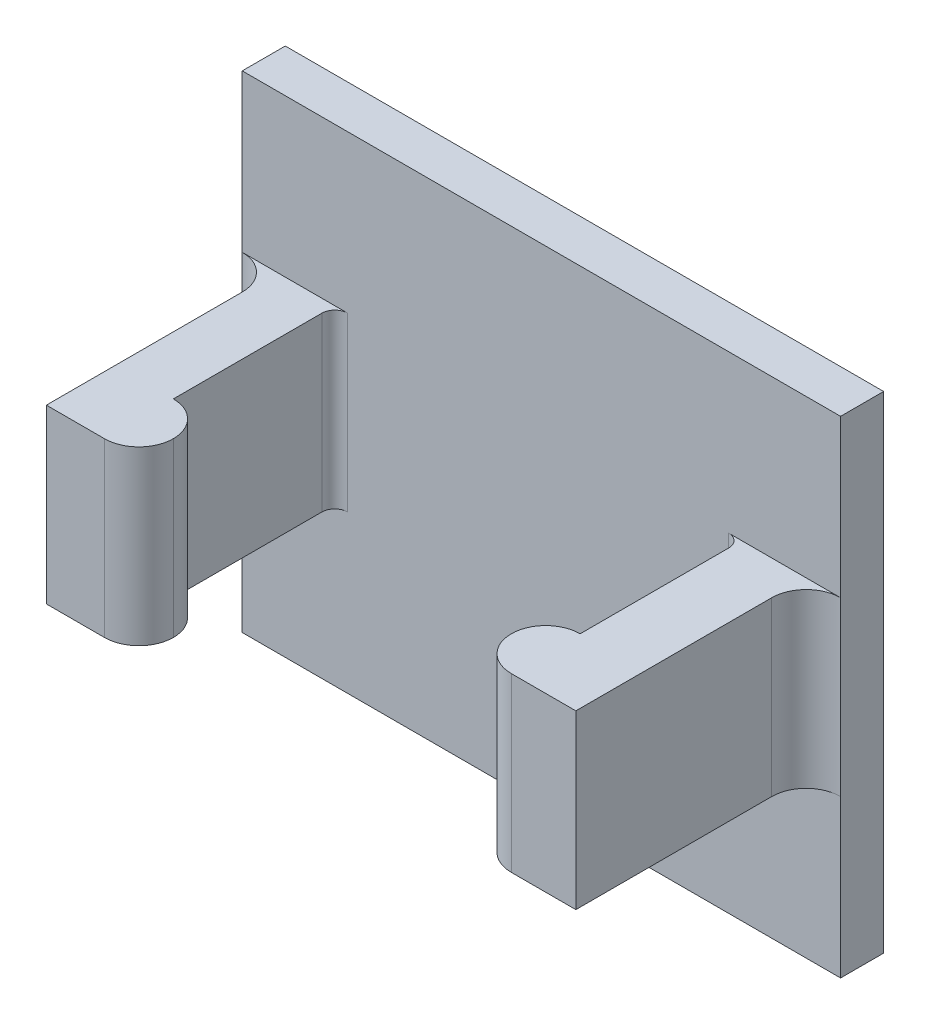
ISO-10303-21;
HEADER;
FILE_DESCRIPTION(('STEP AP214'),'2;1');
FILE_NAME('part.step','',(''),(''),'','','');
FILE_SCHEMA(('AUTOMOTIVE_DESIGN { 1 0 10303 214 1 1 1 1 }'));
ENDSEC;
DATA;
#1=APPLICATION_CONTEXT('core data for automotive mechanical design processes');
#2=APPLICATION_PROTOCOL_DEFINITION('international standard','automotive_design',2000,#1);
#3=PRODUCT_CONTEXT('',#1,'mechanical');
#4=PRODUCT('Part','Part','',(#3));
#5=PRODUCT_RELATED_PRODUCT_CATEGORY('part','',(#4));
#6=PRODUCT_DEFINITION_FORMATION('','',#4);
#7=PRODUCT_DEFINITION_CONTEXT('part definition',#1,'design');
#8=PRODUCT_DEFINITION('design','',#6,#7);
#9=PRODUCT_DEFINITION_SHAPE('','',#8);
#10=(LENGTH_UNIT() NAMED_UNIT(*) SI_UNIT(.MILLI.,.METRE.));
#11=(NAMED_UNIT(*) PLANE_ANGLE_UNIT() SI_UNIT($,.RADIAN.));
#12=(NAMED_UNIT(*) SI_UNIT($,.STERADIAN.) SOLID_ANGLE_UNIT());
#13=UNCERTAINTY_MEASURE_WITH_UNIT(LENGTH_MEASURE(1.E-05),#10,'distance_accuracy_value','');
#14=(GEOMETRIC_REPRESENTATION_CONTEXT(3) GLOBAL_UNCERTAINTY_ASSIGNED_CONTEXT((#13)) GLOBAL_UNIT_ASSIGNED_CONTEXT((#10,
#11,#12)) REPRESENTATION_CONTEXT('',''));
#15=CARTESIAN_POINT('',(0.,0.,0.));
#16=DIRECTION('',(0.,0.,1.));
#17=DIRECTION('',(1.,0.,0.));
#18=AXIS2_PLACEMENT_3D('',#15,#16,#17);
#19=CARTESIAN_POINT('',(6.15,-5.65,1.));
#20=DIRECTION('',(-1.,0.,0.));
#21=DIRECTION('',(0.,0.,1.));
#22=AXIS2_PLACEMENT_3D('',#19,#20,#21);
#23=PLANE('',#22);
#24=DIRECTION('',(0.,0.,-1.));
#25=VECTOR('',#24,1.);
#26=CARTESIAN_POINT('',(6.15,-2.,6.35));
#27=LINE('',#26,#25);
#28=CARTESIAN_POINT('',(6.15,-2.,6.35));
#29=VERTEX_POINT('',#28);
#30=CARTESIAN_POINT('',(6.15,-2.,1.8));
#31=VERTEX_POINT('',#30);
#32=EDGE_CURVE('E259',#29,#31,#27,.T.);
#33=ORIENTED_EDGE('',*,*,#32,.T.);
#34=DIRECTION('',(0.,-1.,0.));
#35=VECTOR('',#34,1.);
#36=CARTESIAN_POINT('',(6.15,2.,1.8));
#37=LINE('',#36,#35);
#38=CARTESIAN_POINT('',(6.15,2.,1.8));
#39=VERTEX_POINT('',#38);
#40=EDGE_CURVE('E63',#31,#39,#37,.F.);
#41=ORIENTED_EDGE('',*,*,#40,.T.);
#42=DIRECTION('',(0.,0.,-1.));
#43=VECTOR('',#42,1.);
#44=CARTESIAN_POINT('',(6.15,2.,6.35));
#45=LINE('',#44,#43);
#46=CARTESIAN_POINT('',(6.15,2.,6.35));
#47=VERTEX_POINT('',#46);
#48=EDGE_CURVE('E274',#47,#39,#45,.T.);
#49=ORIENTED_EDGE('',*,*,#48,.F.);
#50=DIRECTION('',(0.,1.,0.));
#51=VECTOR('',#50,1.);
#52=CARTESIAN_POINT('',(6.15,2.,6.35));
#53=LINE('',#52,#51);
#54=EDGE_CURVE('E247',#29,#47,#53,.T.);
#55=ORIENTED_EDGE('',*,*,#54,.F.);
#56=EDGE_LOOP('',(#33,#41,#49,#55));
#57=FACE_BOUND('',#56,.T.);
#58=ADVANCED_FACE('F41',(#57),#23,.F.);
#59=CARTESIAN_POINT('',(-6.15,-5.65,1.));
#60=DIRECTION('',(1.,0.,0.));
#61=DIRECTION('',(0.,0.,-1.));
#62=AXIS2_PLACEMENT_3D('',#59,#60,#61);
#63=PLANE('',#62);
#64=DIRECTION('',(0.,0.,-1.));
#65=VECTOR('',#64,1.);
#66=CARTESIAN_POINT('',(-6.15,2.,6.35));
#67=LINE('',#66,#65);
#68=CARTESIAN_POINT('',(-6.15,2.,6.35));
#69=VERTEX_POINT('',#68);
#70=CARTESIAN_POINT('',(-6.15,2.,1.8));
#71=VERTEX_POINT('',#70);
#72=EDGE_CURVE('E290',#69,#71,#67,.T.);
#73=ORIENTED_EDGE('',*,*,#72,.T.);
#74=DIRECTION('',(0.,1.,0.));
#75=VECTOR('',#74,1.);
#76=CARTESIAN_POINT('',(-6.15,-2.,1.8));
#77=LINE('',#76,#75);
#78=CARTESIAN_POINT('',(-6.15,-2.,1.8));
#79=VERTEX_POINT('',#78);
#80=EDGE_CURVE('E385',#71,#79,#77,.F.);
#81=ORIENTED_EDGE('',*,*,#80,.T.);
#82=DIRECTION('',(0.,0.,-1.));
#83=VECTOR('',#82,1.);
#84=CARTESIAN_POINT('',(-6.15,-2.,6.35));
#85=LINE('',#84,#83);
#86=CARTESIAN_POINT('',(-6.15,-2.,6.35));
#87=VERTEX_POINT('',#86);
#88=EDGE_CURVE('E306',#87,#79,#85,.T.);
#89=ORIENTED_EDGE('',*,*,#88,.F.);
#90=DIRECTION('',(0.,-1.,0.));
#91=VECTOR('',#90,1.);
#92=CARTESIAN_POINT('',(-6.15,2.,6.35));
#93=LINE('',#92,#91);
#94=EDGE_CURVE('E278',#69,#87,#93,.T.);
#95=ORIENTED_EDGE('',*,*,#94,.F.);
#96=EDGE_LOOP('',(#73,#81,#89,#95));
#97=FACE_BOUND('',#96,.T.);
#98=ADVANCED_FACE('F434',(#97),#63,.F.);
#99=CARTESIAN_POINT('',(4.65,2.,6.35));
#100=DIRECTION('',(1.,0.,0.));
#101=DIRECTION('',(0.,0.,-1.));
#102=AXIS2_PLACEMENT_3D('',#99,#100,#101);
#103=PLANE('',#102);
#104=DIRECTION('',(0.,0.,-1.));
#105=VECTOR('',#104,1.);
#106=CARTESIAN_POINT('',(4.65,2.,6.35));
#107=LINE('',#106,#105);
#108=CARTESIAN_POINT('',(4.65,2.,4.75));
#109=VERTEX_POINT('',#108);
#110=CARTESIAN_POINT('',(4.65,2.,1.3));
#111=VERTEX_POINT('',#110);
#112=EDGE_CURVE('E270',#109,#111,#107,.T.);
#113=ORIENTED_EDGE('',*,*,#112,.T.);
#114=DIRECTION('',(0.,-1.,0.));
#115=VECTOR('',#114,1.);
#116=CARTESIAN_POINT('',(4.65,-2.,1.3));
#117=LINE('',#116,#115);
#118=CARTESIAN_POINT('',(4.65,-2.,1.3));
#119=VERTEX_POINT('',#118);
#120=EDGE_CURVE('E349',#111,#119,#117,.T.);
#121=ORIENTED_EDGE('',*,*,#120,.T.);
#122=DIRECTION('',(0.,0.,-1.));
#123=VECTOR('',#122,1.);
#124=CARTESIAN_POINT('',(4.65,-2.,6.35));
#125=LINE('',#124,#123);
#126=CARTESIAN_POINT('',(4.65,-2.,4.75));
#127=VERTEX_POINT('',#126);
#128=EDGE_CURVE('E266',#127,#119,#125,.T.);
#129=ORIENTED_EDGE('',*,*,#128,.F.);
#130=DIRECTION('',(0.,-1.,0.));
#131=VECTOR('',#130,1.);
#132=CARTESIAN_POINT('',(4.65,2.,4.75));
#133=LINE('',#132,#131);
#134=EDGE_CURVE('E237',#109,#127,#133,.T.);
#135=ORIENTED_EDGE('',*,*,#134,.F.);
#136=EDGE_LOOP('',(#113,#121,#129,#135));
#137=FACE_BOUND('',#136,.T.);
#138=ADVANCED_FACE('F439',(#137),#103,.F.);
#139=CARTESIAN_POINT('',(-4.8,2.,6.35));
#140=DIRECTION('',(-1.,0.,0.));
#141=DIRECTION('',(0.,0.,1.));
#142=AXIS2_PLACEMENT_3D('',#139,#140,#141);
#143=PLANE('',#142);
#144=DIRECTION('',(0.,0.,-1.));
#145=VECTOR('',#144,1.);
#146=CARTESIAN_POINT('',(-4.8,-2.,6.35));
#147=LINE('',#146,#145);
#148=CARTESIAN_POINT('',(-4.8,-2.,4.75));
#149=VERTEX_POINT('',#148);
#150=CARTESIAN_POINT('',(-4.8,-2.,1.3));
#151=VERTEX_POINT('',#150);
#152=EDGE_CURVE('E302',#149,#151,#147,.T.);
#153=ORIENTED_EDGE('',*,*,#152,.T.);
#154=DIRECTION('',(0.,1.,0.));
#155=VECTOR('',#154,1.);
#156=CARTESIAN_POINT('',(-4.8,2.,1.3));
#157=LINE('',#156,#155);
#158=CARTESIAN_POINT('',(-4.8,2.,1.3));
#159=VERTEX_POINT('',#158);
#160=EDGE_CURVE('E367',#151,#159,#157,.T.);
#161=ORIENTED_EDGE('',*,*,#160,.T.);
#162=DIRECTION('',(0.,0.,-1.));
#163=VECTOR('',#162,1.);
#164=CARTESIAN_POINT('',(-4.8,2.,6.35));
#165=LINE('',#164,#163);
#166=CARTESIAN_POINT('',(-4.8,2.,4.75));
#167=VERTEX_POINT('',#166);
#168=EDGE_CURVE('E298',#167,#159,#165,.T.);
#169=ORIENTED_EDGE('',*,*,#168,.F.);
#170=DIRECTION('',(0.,1.,0.));
#171=VECTOR('',#170,1.);
#172=CARTESIAN_POINT('',(-4.8,2.,4.75));
#173=LINE('',#172,#171);
#174=EDGE_CURVE('E241',#149,#167,#173,.T.);
#175=ORIENTED_EDGE('',*,*,#174,.F.);
#176=EDGE_LOOP('',(#153,#161,#169,#175));
#177=FACE_BOUND('',#176,.T.);
#178=ADVANCED_FACE('F491',(#177),#143,.F.);
#179=CARTESIAN_POINT('',(0.,0.,1.));
#180=DIRECTION('',(0.,0.,-1.));
#181=DIRECTION('',(-1.,0.,0.));
#182=AXIS2_PLACEMENT_3D('',#179,#180,#181);
#183=PLANE('',#182);
#184=DIRECTION('',(0.,1.,0.));
#185=VECTOR('',#184,1.);
#186=CARTESIAN_POINT('',(-6.95,5.65,1.));
#187=LINE('',#186,#185);
#188=CARTESIAN_POINT('',(-6.95,2.,1.));
#189=VERTEX_POINT('',#188);
#190=CARTESIAN_POINT('',(-6.95,5.65,1.));
#191=VERTEX_POINT('',#190);
#192=EDGE_CURVE('E228',#189,#191,#187,.T.);
#193=ORIENTED_EDGE('',*,*,#192,.F.);
#194=DIRECTION('',(-1.,0.,0.));
#195=VECTOR('',#194,1.);
#196=CARTESIAN_POINT('',(-6.15,2.,1.));
#197=LINE('',#196,#195);
#198=CARTESIAN_POINT('',(-4.5,2.,1.));
#199=VERTEX_POINT('',#198);
#200=EDGE_CURVE('E283',#199,#189,#197,.T.);
#201=ORIENTED_EDGE('',*,*,#200,.F.);
#202=DIRECTION('',(0.,1.,0.));
#203=VECTOR('',#202,1.);
#204=CARTESIAN_POINT('',(-4.5,-2.,1.));
#205=LINE('',#204,#203);
#206=CARTESIAN_POINT('',(-4.5,-2.,1.));
#207=VERTEX_POINT('',#206);
#208=EDGE_CURVE('E359',#199,#207,#205,.F.);
#209=ORIENTED_EDGE('',*,*,#208,.T.);
#210=DIRECTION('',(1.,0.,0.));
#211=VECTOR('',#210,1.);
#212=CARTESIAN_POINT('',(-6.15,-2.,1.));
#213=LINE('',#212,#211);
#214=CARTESIAN_POINT('',(-6.95,-2.,1.));
#215=VERTEX_POINT('',#214);
#216=EDGE_CURVE('E277',#215,#207,#213,.T.);
#217=ORIENTED_EDGE('',*,*,#216,.F.);
#218=CARTESIAN_POINT('',(-6.95,-5.65,1.));
#219=VERTEX_POINT('',#218);
#220=EDGE_CURVE('E200',#219,#215,#187,.T.);
#221=ORIENTED_EDGE('',*,*,#220,.F.);
#222=DIRECTION('',(1.,0.,0.));
#223=VECTOR('',#222,1.);
#224=CARTESIAN_POINT('',(-6.15,-5.65,1.));
#225=LINE('',#224,#223);
#226=CARTESIAN_POINT('',(6.95,-5.65,1.));
#227=VERTEX_POINT('',#226);
#228=EDGE_CURVE('E196',#219,#227,#225,.T.);
#229=ORIENTED_EDGE('',*,*,#228,.T.);
#230=DIRECTION('',(0.,-1.,0.));
#231=VECTOR('',#230,1.);
#232=CARTESIAN_POINT('',(6.95,5.65,1.));
#233=LINE('',#232,#231);
#234=CARTESIAN_POINT('',(6.95,-2.,1.));
#235=VERTEX_POINT('',#234);
#236=EDGE_CURVE('E181',#235,#227,#233,.T.);
#237=ORIENTED_EDGE('',*,*,#236,.F.);
#238=DIRECTION('',(1.,0.,0.));
#239=VECTOR('',#238,1.);
#240=CARTESIAN_POINT('',(6.15,-2.,1.));
#241=LINE('',#240,#239);
#242=CARTESIAN_POINT('',(4.35,-2.,1.));
#243=VERTEX_POINT('',#242);
#244=EDGE_CURVE('E252',#243,#235,#241,.T.);
#245=ORIENTED_EDGE('',*,*,#244,.F.);
#246=DIRECTION('',(0.,-1.,0.));
#247=VECTOR('',#246,1.);
#248=CARTESIAN_POINT('',(4.35,2.,1.));
#249=LINE('',#248,#247);
#250=CARTESIAN_POINT('',(4.35,2.,1.));
#251=VERTEX_POINT('',#250);
#252=EDGE_CURVE('E363',#243,#251,#249,.F.);
#253=ORIENTED_EDGE('',*,*,#252,.T.);
#254=DIRECTION('',(-1.,0.,0.));
#255=VECTOR('',#254,1.);
#256=CARTESIAN_POINT('',(6.15,2.,1.));
#257=LINE('',#256,#255);
#258=CARTESIAN_POINT('',(6.95,2.,1.));
#259=VERTEX_POINT('',#258);
#260=EDGE_CURVE('E246',#259,#251,#257,.T.);
#261=ORIENTED_EDGE('',*,*,#260,.F.);
#262=CARTESIAN_POINT('',(6.95,5.65,1.));
#263=VERTEX_POINT('',#262);
#264=EDGE_CURVE('E194',#263,#259,#233,.T.);
#265=ORIENTED_EDGE('',*,*,#264,.F.);
#266=DIRECTION('',(-1.,0.,0.));
#267=VECTOR('',#266,1.);
#268=CARTESIAN_POINT('',(-6.15,5.65,1.));
#269=LINE('',#268,#267);
#270=EDGE_CURVE('E206',#263,#191,#269,.T.);
#271=ORIENTED_EDGE('',*,*,#270,.T.);
#272=EDGE_LOOP('',(#193,#201,#209,#217,#221,#229,#237,#245,#253,#261,#265,#271));
#273=FACE_BOUND('',#272,.T.);
#274=ADVANCED_FACE('F198',(#273),#183,.F.);
#275=CARTESIAN_POINT('',(-6.15,5.65,1.));
#276=DIRECTION('',(0.,-1.,0.));
#277=DIRECTION('',(0.,0.,-1.));
#278=AXIS2_PLACEMENT_3D('',#275,#276,#277);
#279=PLANE('',#278);
#280=DIRECTION('',(-1.,0.,0.));
#281=VECTOR('',#280,1.);
#282=CARTESIAN_POINT('',(-6.15,5.65,0.));
#283=LINE('',#282,#281);
#284=CARTESIAN_POINT('',(6.95,5.65,0.));
#285=VERTEX_POINT('',#284);
#286=CARTESIAN_POINT('',(-6.95,5.65,0.));
#287=VERTEX_POINT('',#286);
#288=EDGE_CURVE('E310',#285,#287,#283,.T.);
#289=ORIENTED_EDGE('',*,*,#288,.T.);
#290=DIRECTION('',(0.,0.,-1.));
#291=VECTOR('',#290,1.);
#292=CARTESIAN_POINT('',(-6.95,5.65,0.));
#293=LINE('',#292,#291);
#294=EDGE_CURVE('E231',#191,#287,#293,.T.);
#295=ORIENTED_EDGE('',*,*,#294,.F.);
#296=ORIENTED_EDGE('',*,*,#270,.F.);
#297=DIRECTION('',(0.,0.,1.));
#298=VECTOR('',#297,1.);
#299=CARTESIAN_POINT('',(6.95,5.65,1.));
#300=LINE('',#299,#298);
#301=EDGE_CURVE('E215',#285,#263,#300,.T.);
#302=ORIENTED_EDGE('',*,*,#301,.F.);
#303=EDGE_LOOP('',(#289,#295,#296,#302));
#304=FACE_BOUND('',#303,.T.);
#305=ADVANCED_FACE('F408',(#304),#279,.F.);
#306=CARTESIAN_POINT('',(-6.15,-5.65,1.));
#307=DIRECTION('',(0.,1.,0.));
#308=DIRECTION('',(0.,0.,1.));
#309=AXIS2_PLACEMENT_3D('',#306,#307,#308);
#310=PLANE('',#309);
#311=DIRECTION('',(1.,0.,0.));
#312=VECTOR('',#311,1.);
#313=CARTESIAN_POINT('',(-6.15,-5.65,0.));
#314=LINE('',#313,#312);
#315=CARTESIAN_POINT('',(-6.95,-5.65,0.));
#316=VERTEX_POINT('',#315);
#317=CARTESIAN_POINT('',(6.95,-5.65,0.));
#318=VERTEX_POINT('',#317);
#319=EDGE_CURVE('E209',#316,#318,#314,.T.);
#320=ORIENTED_EDGE('',*,*,#319,.T.);
#321=DIRECTION('',(0.,0.,-1.));
#322=VECTOR('',#321,1.);
#323=CARTESIAN_POINT('',(6.95,-5.65,1.));
#324=LINE('',#323,#322);
#325=EDGE_CURVE('E187',#227,#318,#324,.T.);
#326=ORIENTED_EDGE('',*,*,#325,.F.);
#327=ORIENTED_EDGE('',*,*,#228,.F.);
#328=DIRECTION('',(0.,0.,1.));
#329=VECTOR('',#328,1.);
#330=CARTESIAN_POINT('',(-6.95,-5.65,0.));
#331=LINE('',#330,#329);
#332=EDGE_CURVE('E225',#316,#219,#331,.T.);
#333=ORIENTED_EDGE('',*,*,#332,.F.);
#334=EDGE_LOOP('',(#320,#326,#327,#333));
#335=FACE_BOUND('',#334,.T.);
#336=ADVANCED_FACE('F208',(#335),#310,.F.);
#337=CARTESIAN_POINT('',(0.,0.,0.));
#338=DIRECTION('',(0.,0.,-1.));
#339=DIRECTION('',(-1.,0.,0.));
#340=AXIS2_PLACEMENT_3D('',#337,#338,#339);
#341=PLANE('',#340);
#342=ORIENTED_EDGE('',*,*,#288,.F.);
#343=DIRECTION('',(0.,1.,0.));
#344=VECTOR('',#343,1.);
#345=CARTESIAN_POINT('',(6.95,5.65,0.));
#346=LINE('',#345,#344);
#347=EDGE_CURVE('E211',#318,#285,#346,.T.);
#348=ORIENTED_EDGE('',*,*,#347,.F.);
#349=ORIENTED_EDGE('',*,*,#319,.F.);
#350=DIRECTION('',(0.,-1.,0.));
#351=VECTOR('',#350,1.);
#352=CARTESIAN_POINT('',(-6.95,5.65,0.));
#353=LINE('',#352,#351);
#354=EDGE_CURVE('E221',#287,#316,#353,.T.);
#355=ORIENTED_EDGE('',*,*,#354,.F.);
#356=EDGE_LOOP('',(#342,#348,#349,#355));
#357=FACE_BOUND('',#356,.T.);
#358=ADVANCED_FACE('F410',(#357),#341,.T.);
#359=CARTESIAN_POINT('',(-6.15,-2.,6.35));
#360=DIRECTION('',(0.,1.,0.));
#361=DIRECTION('',(0.,0.,1.));
#362=AXIS2_PLACEMENT_3D('',#359,#360,#361);
#363=PLANE('',#362);
#364=CARTESIAN_POINT('',(-4.8,-2.,5.55));
#365=DIRECTION('',(0.,1.,0.));
#366=DIRECTION('',(0.,0.,1.));
#367=AXIS2_PLACEMENT_3D('',#364,#365,#366);
#368=CIRCLE('',#367,0.8);
#369=CARTESIAN_POINT('',(-4.,-2.,5.55));
#370=VERTEX_POINT('',#369);
#371=EDGE_CURVE('E333',#149,#370,#368,.F.);
#372=ORIENTED_EDGE('',*,*,#371,.T.);
#373=CARTESIAN_POINT('',(-4.8,-2.,5.55));
#374=DIRECTION('',(0.,1.,0.));
#375=DIRECTION('',(0.,0.,1.));
#376=AXIS2_PLACEMENT_3D('',#373,#374,#375);
#377=CIRCLE('',#376,0.8);
#378=CARTESIAN_POINT('',(-4.8,-2.,6.35));
#379=VERTEX_POINT('',#378);
#380=EDGE_CURVE('E336',#370,#379,#377,.F.);
#381=ORIENTED_EDGE('',*,*,#380,.T.);
#382=DIRECTION('',(1.,0.,0.));
#383=VECTOR('',#382,1.);
#384=CARTESIAN_POINT('',(-6.15,-2.,6.35));
#385=LINE('',#384,#383);
#386=EDGE_CURVE('E282',#87,#379,#385,.T.);
#387=ORIENTED_EDGE('',*,*,#386,.F.);
#388=ORIENTED_EDGE('',*,*,#88,.T.);
#389=CARTESIAN_POINT('',(-6.95,-2.,1.8));
#390=DIRECTION('',(0.,1.,0.));
#391=DIRECTION('',(0.,0.,1.));
#392=AXIS2_PLACEMENT_3D('',#389,#390,#391);
#393=CIRCLE('',#392,0.8);
#394=EDGE_CURVE('E393',#79,#215,#393,.T.);
#395=ORIENTED_EDGE('',*,*,#394,.T.);
#396=ORIENTED_EDGE('',*,*,#216,.T.);
#397=CARTESIAN_POINT('',(-4.5,-2.,1.3));
#398=DIRECTION('',(0.,1.,0.));
#399=DIRECTION('',(0.,0.,1.));
#400=AXIS2_PLACEMENT_3D('',#397,#398,#399);
#401=CIRCLE('',#400,0.3);
#402=EDGE_CURVE('E382',#207,#151,#401,.T.);
#403=ORIENTED_EDGE('',*,*,#402,.T.);
#404=ORIENTED_EDGE('',*,*,#152,.F.);
#405=EDGE_LOOP('',(#372,#381,#387,#388,#395,#396,#403,#404));
#406=FACE_BOUND('',#405,.T.);
#407=ADVANCED_FACE('F478',(#406),#363,.F.);
#408=CARTESIAN_POINT('',(-6.15,2.,6.35));
#409=DIRECTION('',(0.,-1.,0.));
#410=DIRECTION('',(0.,0.,-1.));
#411=AXIS2_PLACEMENT_3D('',#408,#409,#410);
#412=PLANE('',#411);
#413=DIRECTION('',(-1.,0.,0.));
#414=VECTOR('',#413,1.);
#415=CARTESIAN_POINT('',(-6.15,2.,6.35));
#416=LINE('',#415,#414);
#417=CARTESIAN_POINT('',(-4.8,2.,6.35));
#418=VERTEX_POINT('',#417);
#419=EDGE_CURVE('E287',#418,#69,#416,.T.);
#420=ORIENTED_EDGE('',*,*,#419,.F.);
#421=CARTESIAN_POINT('',(-4.8,2.,5.55));
#422=DIRECTION('',(0.,-1.,0.));
#423=DIRECTION('',(0.,0.,-1.));
#424=AXIS2_PLACEMENT_3D('',#421,#422,#423);
#425=CIRCLE('',#424,0.8);
#426=CARTESIAN_POINT('',(-4.,2.,5.55));
#427=VERTEX_POINT('',#426);
#428=EDGE_CURVE('E346',#418,#427,#425,.F.);
#429=ORIENTED_EDGE('',*,*,#428,.T.);
#430=CARTESIAN_POINT('',(-4.8,2.,5.55));
#431=DIRECTION('',(0.,-1.,0.));
#432=DIRECTION('',(0.,0.,-1.));
#433=AXIS2_PLACEMENT_3D('',#430,#431,#432);
#434=CIRCLE('',#433,0.8);
#435=EDGE_CURVE('E343',#427,#167,#434,.F.);
#436=ORIENTED_EDGE('',*,*,#435,.T.);
#437=ORIENTED_EDGE('',*,*,#168,.T.);
#438=CARTESIAN_POINT('',(-4.5,2.,1.3));
#439=DIRECTION('',(0.,-1.,0.));
#440=DIRECTION('',(0.,0.,-1.));
#441=AXIS2_PLACEMENT_3D('',#438,#439,#440);
#442=CIRCLE('',#441,0.3);
#443=EDGE_CURVE('E378',#159,#199,#442,.T.);
#444=ORIENTED_EDGE('',*,*,#443,.T.);
#445=ORIENTED_EDGE('',*,*,#200,.T.);
#446=CARTESIAN_POINT('',(-6.95,2.,1.8));
#447=DIRECTION('',(0.,-1.,0.));
#448=DIRECTION('',(0.,0.,-1.));
#449=AXIS2_PLACEMENT_3D('',#446,#447,#448);
#450=CIRCLE('',#449,0.8);
#451=EDGE_CURVE('E390',#189,#71,#450,.T.);
#452=ORIENTED_EDGE('',*,*,#451,.T.);
#453=ORIENTED_EDGE('',*,*,#72,.F.);
#454=EDGE_LOOP('',(#420,#429,#436,#437,#444,#445,#452,#453));
#455=FACE_BOUND('',#454,.T.);
#456=ADVANCED_FACE('F484',(#455),#412,.F.);
#457=CARTESIAN_POINT('',(0.,0.,6.35));
#458=DIRECTION('',(0.,0.,1.));
#459=DIRECTION('',(1.,0.,0.));
#460=AXIS2_PLACEMENT_3D('',#457,#458,#459);
#461=PLANE('',#460);
#462=ORIENTED_EDGE('',*,*,#386,.T.);
#463=DIRECTION('',(0.,-1.,0.));
#464=VECTOR('',#463,1.);
#465=CARTESIAN_POINT('',(-4.8,0.,6.35));
#466=LINE('',#465,#464);
#467=EDGE_CURVE('E339',#379,#418,#466,.F.);
#468=ORIENTED_EDGE('',*,*,#467,.T.);
#469=ORIENTED_EDGE('',*,*,#419,.T.);
#470=ORIENTED_EDGE('',*,*,#94,.T.);
#471=EDGE_LOOP('',(#462,#468,#469,#470));
#472=FACE_BOUND('',#471,.T.);
#473=ADVANCED_FACE('F430',(#472),#461,.T.);
#474=CARTESIAN_POINT('',(6.15,2.,6.35));
#475=DIRECTION('',(0.,-1.,0.));
#476=DIRECTION('',(0.,0.,-1.));
#477=AXIS2_PLACEMENT_3D('',#474,#475,#476);
#478=PLANE('',#477);
#479=CARTESIAN_POINT('',(4.65,2.,5.55));
#480=DIRECTION('',(0.,-1.,0.));
#481=DIRECTION('',(0.,0.,-1.));
#482=AXIS2_PLACEMENT_3D('',#479,#480,#481);
#483=CIRCLE('',#482,0.8);
#484=CARTESIAN_POINT('',(3.85,2.,5.55));
#485=VERTEX_POINT('',#484);
#486=EDGE_CURVE('E205',#109,#485,#483,.F.);
#487=ORIENTED_EDGE('',*,*,#486,.T.);
#488=CARTESIAN_POINT('',(4.65,2.,5.55));
#489=DIRECTION('',(0.,-1.,0.));
#490=DIRECTION('',(0.,0.,-1.));
#491=AXIS2_PLACEMENT_3D('',#488,#489,#490);
#492=CIRCLE('',#491,0.8);
#493=CARTESIAN_POINT('',(4.65,2.,6.35));
#494=VERTEX_POINT('',#493);
#495=EDGE_CURVE('E320',#485,#494,#492,.F.);
#496=ORIENTED_EDGE('',*,*,#495,.T.);
#497=DIRECTION('',(-1.,0.,0.));
#498=VECTOR('',#497,1.);
#499=CARTESIAN_POINT('',(6.15,2.,6.35));
#500=LINE('',#499,#498);
#501=EDGE_CURVE('E251',#47,#494,#500,.T.);
#502=ORIENTED_EDGE('',*,*,#501,.F.);
#503=ORIENTED_EDGE('',*,*,#48,.T.);
#504=CARTESIAN_POINT('',(6.95,2.,1.8));
#505=DIRECTION('',(0.,-1.,0.));
#506=DIRECTION('',(0.,0.,-1.));
#507=AXIS2_PLACEMENT_3D('',#504,#505,#506);
#508=CIRCLE('',#507,0.8);
#509=EDGE_CURVE('E11',#39,#259,#508,.T.);
#510=ORIENTED_EDGE('',*,*,#509,.T.);
#511=ORIENTED_EDGE('',*,*,#260,.T.);
#512=CARTESIAN_POINT('',(4.35,2.,1.3));
#513=DIRECTION('',(0.,-1.,0.));
#514=DIRECTION('',(0.,0.,-1.));
#515=AXIS2_PLACEMENT_3D('',#512,#513,#514);
#516=CIRCLE('',#515,0.3);
#517=EDGE_CURVE('E375',#251,#111,#516,.T.);
#518=ORIENTED_EDGE('',*,*,#517,.T.);
#519=ORIENTED_EDGE('',*,*,#112,.F.);
#520=EDGE_LOOP('',(#487,#496,#502,#503,#510,#511,#518,#519));
#521=FACE_BOUND('',#520,.T.);
#522=ADVANCED_FACE('F415',(#521),#478,.F.);
#523=CARTESIAN_POINT('',(6.15,-2.,6.35));
#524=DIRECTION('',(0.,1.,0.));
#525=DIRECTION('',(0.,0.,1.));
#526=AXIS2_PLACEMENT_3D('',#523,#524,#525);
#527=PLANE('',#526);
#528=DIRECTION('',(1.,0.,0.));
#529=VECTOR('',#528,1.);
#530=CARTESIAN_POINT('',(6.15,-2.,6.35));
#531=LINE('',#530,#529);
#532=CARTESIAN_POINT('',(4.65,-2.,6.35));
#533=VERTEX_POINT('',#532);
#534=EDGE_CURVE('E256',#533,#29,#531,.T.);
#535=ORIENTED_EDGE('',*,*,#534,.F.);
#536=CARTESIAN_POINT('',(4.65,-2.,5.55));
#537=DIRECTION('',(0.,1.,0.));
#538=DIRECTION('',(0.,0.,1.));
#539=AXIS2_PLACEMENT_3D('',#536,#537,#538);
#540=CIRCLE('',#539,0.8);
#541=CARTESIAN_POINT('',(3.85,-2.,5.55));
#542=VERTEX_POINT('',#541);
#543=EDGE_CURVE('E330',#533,#542,#540,.F.);
#544=ORIENTED_EDGE('',*,*,#543,.T.);
#545=CARTESIAN_POINT('',(4.65,-2.,5.55));
#546=DIRECTION('',(0.,1.,0.));
#547=DIRECTION('',(0.,0.,1.));
#548=AXIS2_PLACEMENT_3D('',#545,#546,#547);
#549=CIRCLE('',#548,0.8);
#550=EDGE_CURVE('E327',#542,#127,#549,.F.);
#551=ORIENTED_EDGE('',*,*,#550,.T.);
#552=ORIENTED_EDGE('',*,*,#128,.T.);
#553=CARTESIAN_POINT('',(4.35,-2.,1.3));
#554=DIRECTION('',(0.,1.,0.));
#555=DIRECTION('',(0.,0.,1.));
#556=AXIS2_PLACEMENT_3D('',#553,#554,#555);
#557=CIRCLE('',#556,0.3);
#558=EDGE_CURVE('E371',#119,#243,#557,.T.);
#559=ORIENTED_EDGE('',*,*,#558,.T.);
#560=ORIENTED_EDGE('',*,*,#244,.T.);
#561=CARTESIAN_POINT('',(6.95,-2.,1.8));
#562=DIRECTION('',(0.,1.,0.));
#563=DIRECTION('',(0.,0.,1.));
#564=AXIS2_PLACEMENT_3D('',#561,#562,#563);
#565=CIRCLE('',#564,0.8);
#566=EDGE_CURVE('E50',#235,#31,#565,.T.);
#567=ORIENTED_EDGE('',*,*,#566,.T.);
#568=ORIENTED_EDGE('',*,*,#32,.F.);
#569=EDGE_LOOP('',(#535,#544,#551,#552,#559,#560,#567,#568));
#570=FACE_BOUND('',#569,.T.);
#571=ADVANCED_FACE('F421',(#570),#527,.F.);
#572=CARTESIAN_POINT('',(0.,0.,6.35));
#573=DIRECTION('',(0.,0.,-1.));
#574=DIRECTION('',(-1.,0.,0.));
#575=AXIS2_PLACEMENT_3D('',#572,#573,#574);
#576=PLANE('',#575);
#577=ORIENTED_EDGE('',*,*,#501,.T.);
#578=DIRECTION('',(0.,1.,0.));
#579=VECTOR('',#578,1.);
#580=CARTESIAN_POINT('',(4.65,0.,6.35));
#581=LINE('',#580,#579);
#582=EDGE_CURVE('E323',#494,#533,#581,.F.);
#583=ORIENTED_EDGE('',*,*,#582,.T.);
#584=ORIENTED_EDGE('',*,*,#534,.T.);
#585=ORIENTED_EDGE('',*,*,#54,.T.);
#586=EDGE_LOOP('',(#577,#583,#584,#585));
#587=FACE_BOUND('',#586,.T.);
#588=ADVANCED_FACE('F418',(#587),#576,.F.);
#589=CARTESIAN_POINT('',(4.65,0.,5.55));
#590=DIRECTION('',(0.,-1.,0.));
#591=DIRECTION('',(0.,0.,-1.));
#592=AXIS2_PLACEMENT_3D('',#589,#590,#591);
#593=CYLINDRICAL_SURFACE('',#592,0.8);
#594=ORIENTED_EDGE('',*,*,#134,.T.);
#595=ORIENTED_EDGE('',*,*,#550,.F.);
#596=DIRECTION('',(0.,-1.,0.));
#597=VECTOR('',#596,1.);
#598=CARTESIAN_POINT('',(3.85,0.,5.55));
#599=LINE('',#598,#597);
#600=EDGE_CURVE('E242',#485,#542,#599,.T.);
#601=ORIENTED_EDGE('',*,*,#600,.F.);
#602=ORIENTED_EDGE('',*,*,#486,.F.);
#603=EDGE_LOOP('',(#594,#595,#601,#602));
#604=FACE_BOUND('',#603,.T.);
#605=ADVANCED_FACE('F428',(#604),#593,.T.);
#606=CARTESIAN_POINT('',(4.65,0.,5.55));
#607=DIRECTION('',(0.,1.,0.));
#608=DIRECTION('',(0.,0.,1.));
#609=AXIS2_PLACEMENT_3D('',#606,#607,#608);
#610=CYLINDRICAL_SURFACE('',#609,0.8);
#611=ORIENTED_EDGE('',*,*,#543,.F.);
#612=ORIENTED_EDGE('',*,*,#582,.F.);
#613=ORIENTED_EDGE('',*,*,#495,.F.);
#614=ORIENTED_EDGE('',*,*,#600,.T.);
#615=EDGE_LOOP('',(#611,#612,#613,#614));
#616=FACE_BOUND('',#615,.T.);
#617=ADVANCED_FACE('F444',(#616),#610,.T.);
#618=CARTESIAN_POINT('',(-4.8,0.,5.55));
#619=DIRECTION('',(0.,-1.,0.));
#620=DIRECTION('',(0.,0.,-1.));
#621=AXIS2_PLACEMENT_3D('',#618,#619,#620);
#622=CYLINDRICAL_SURFACE('',#621,0.8);
#623=ORIENTED_EDGE('',*,*,#174,.T.);
#624=ORIENTED_EDGE('',*,*,#435,.F.);
#625=DIRECTION('',(0.,1.,0.));
#626=VECTOR('',#625,1.);
#627=CARTESIAN_POINT('',(-4.,2.,5.55));
#628=LINE('',#627,#626);
#629=EDGE_CURVE('E236',#370,#427,#628,.T.);
#630=ORIENTED_EDGE('',*,*,#629,.F.);
#631=ORIENTED_EDGE('',*,*,#371,.F.);
#632=EDGE_LOOP('',(#623,#624,#630,#631));
#633=FACE_BOUND('',#632,.T.);
#634=ADVANCED_FACE('F447',(#633),#622,.T.);
#635=CARTESIAN_POINT('',(-4.8,0.,5.55));
#636=DIRECTION('',(0.,-1.,0.));
#637=DIRECTION('',(0.,0.,-1.));
#638=AXIS2_PLACEMENT_3D('',#635,#636,#637);
#639=CYLINDRICAL_SURFACE('',#638,0.8);
#640=ORIENTED_EDGE('',*,*,#428,.F.);
#641=ORIENTED_EDGE('',*,*,#467,.F.);
#642=ORIENTED_EDGE('',*,*,#380,.F.);
#643=ORIENTED_EDGE('',*,*,#629,.T.);
#644=EDGE_LOOP('',(#640,#641,#642,#643));
#645=FACE_BOUND('',#644,.T.);
#646=ADVANCED_FACE('F452',(#645),#639,.T.);
#647=CARTESIAN_POINT('',(4.35,2.,1.3));
#648=DIRECTION('',(0.,1.,0.));
#649=DIRECTION('',(0.,0.,1.));
#650=AXIS2_PLACEMENT_3D('',#647,#648,#649);
#651=CYLINDRICAL_SURFACE('',#650,0.3);
#652=ORIENTED_EDGE('',*,*,#517,.F.);
#653=ORIENTED_EDGE('',*,*,#252,.F.);
#654=ORIENTED_EDGE('',*,*,#558,.F.);
#655=ORIENTED_EDGE('',*,*,#120,.F.);
#656=EDGE_LOOP('',(#652,#653,#654,#655));
#657=FACE_BOUND('',#656,.T.);
#658=ADVANCED_FACE('F455',(#657),#651,.F.);
#659=CARTESIAN_POINT('',(-4.5,2.,1.3));
#660=DIRECTION('',(0.,-1.,0.));
#661=DIRECTION('',(0.,0.,-1.));
#662=AXIS2_PLACEMENT_3D('',#659,#660,#661);
#663=CYLINDRICAL_SURFACE('',#662,0.3);
#664=ORIENTED_EDGE('',*,*,#402,.F.);
#665=ORIENTED_EDGE('',*,*,#208,.F.);
#666=ORIENTED_EDGE('',*,*,#443,.F.);
#667=ORIENTED_EDGE('',*,*,#160,.F.);
#668=EDGE_LOOP('',(#664,#665,#666,#667));
#669=FACE_BOUND('',#668,.T.);
#670=ADVANCED_FACE('F462',(#669),#663,.F.);
#671=CARTESIAN_POINT('',(-6.95,0.,0.));
#672=DIRECTION('',(-1.,0.,0.));
#673=DIRECTION('',(0.,0.,1.));
#674=AXIS2_PLACEMENT_3D('',#671,#672,#673);
#675=PLANE('',#674);
#676=ORIENTED_EDGE('',*,*,#354,.T.);
#677=ORIENTED_EDGE('',*,*,#332,.T.);
#678=ORIENTED_EDGE('',*,*,#220,.T.);
#679=EDGE_CURVE('E232',#215,#189,#187,.T.);
#680=ORIENTED_EDGE('',*,*,#679,.T.);
#681=ORIENTED_EDGE('',*,*,#192,.T.);
#682=ORIENTED_EDGE('',*,*,#294,.T.);
#683=EDGE_LOOP('',(#676,#677,#678,#680,#681,#682));
#684=FACE_BOUND('',#683,.T.);
#685=ADVANCED_FACE('F401',(#684),#675,.T.);
#686=CARTESIAN_POINT('',(6.95,0.,0.));
#687=DIRECTION('',(1.,0.,0.));
#688=DIRECTION('',(0.,0.,-1.));
#689=AXIS2_PLACEMENT_3D('',#686,#687,#688);
#690=PLANE('',#689);
#691=ORIENTED_EDGE('',*,*,#264,.T.);
#692=EDGE_CURVE('E190',#259,#235,#233,.T.);
#693=ORIENTED_EDGE('',*,*,#692,.T.);
#694=ORIENTED_EDGE('',*,*,#236,.T.);
#695=ORIENTED_EDGE('',*,*,#325,.T.);
#696=ORIENTED_EDGE('',*,*,#347,.T.);
#697=ORIENTED_EDGE('',*,*,#301,.T.);
#698=EDGE_LOOP('',(#691,#693,#694,#695,#696,#697));
#699=FACE_BOUND('',#698,.T.);
#700=ADVANCED_FACE('F184',(#699),#690,.T.);
#701=CARTESIAN_POINT('',(-6.95,0.,1.8));
#702=DIRECTION('',(0.,-1.,0.));
#703=DIRECTION('',(0.,0.,-1.));
#704=AXIS2_PLACEMENT_3D('',#701,#702,#703);
#705=CYLINDRICAL_SURFACE('',#704,0.8);
#706=ORIENTED_EDGE('',*,*,#394,.F.);
#707=ORIENTED_EDGE('',*,*,#80,.F.);
#708=ORIENTED_EDGE('',*,*,#451,.F.);
#709=ORIENTED_EDGE('',*,*,#679,.F.);
#710=EDGE_LOOP('',(#706,#707,#708,#709));
#711=FACE_BOUND('',#710,.T.);
#712=ADVANCED_FACE('F466',(#711),#705,.F.);
#713=CARTESIAN_POINT('',(6.95,0.,1.8));
#714=DIRECTION('',(0.,1.,0.));
#715=DIRECTION('',(0.,0.,1.));
#716=AXIS2_PLACEMENT_3D('',#713,#714,#715);
#717=CYLINDRICAL_SURFACE('',#716,0.8);
#718=ORIENTED_EDGE('',*,*,#509,.F.);
#719=ORIENTED_EDGE('',*,*,#40,.F.);
#720=ORIENTED_EDGE('',*,*,#566,.F.);
#721=ORIENTED_EDGE('',*,*,#692,.F.);
#722=EDGE_LOOP('',(#718,#719,#720,#721));
#723=FACE_BOUND('',#722,.T.);
#724=ADVANCED_FACE('F43',(#723),#717,.F.);
#725=CLOSED_SHELL('',(#58,#98,#138,#178,#274,#305,#336,#358,#407,#456,#473,#522,#571,#588,#605,
#617,#634,#646,#658,#670,#685,#700,#712,#724));
#726=MANIFOLD_SOLID_BREP('B2',#725);
#727=ADVANCED_BREP_SHAPE_REPRESENTATION('',(#18,#726),#14);
#728=SHAPE_DEFINITION_REPRESENTATION(#9,#727);
ENDSEC;
END-ISO-10303-21;
